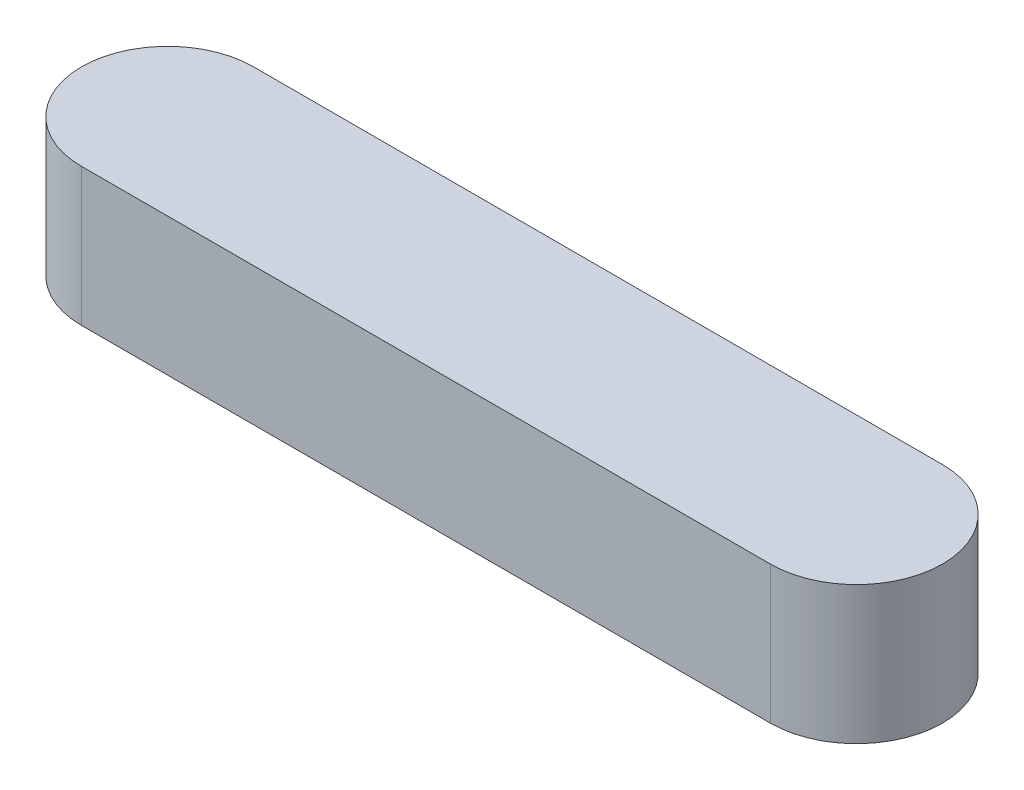
ISO-10303-21;
HEADER;
FILE_DESCRIPTION(('STEP AP214'),'2;1');
FILE_NAME('part.step','',(''),(''),'','','');
FILE_SCHEMA(('AUTOMOTIVE_DESIGN { 1 0 10303 214 1 1 1 1 }'));
ENDSEC;
DATA;
#1=APPLICATION_CONTEXT('core data for automotive mechanical design processes');
#2=APPLICATION_PROTOCOL_DEFINITION('international standard','automotive_design',2000,#1);
#3=PRODUCT_CONTEXT('',#1,'mechanical');
#4=PRODUCT('Part','Part','',(#3));
#5=PRODUCT_RELATED_PRODUCT_CATEGORY('part','',(#4));
#6=PRODUCT_DEFINITION_FORMATION('','',#4);
#7=PRODUCT_DEFINITION_CONTEXT('part definition',#1,'design');
#8=PRODUCT_DEFINITION('design','',#6,#7);
#9=PRODUCT_DEFINITION_SHAPE('','',#8);
#10=(LENGTH_UNIT() NAMED_UNIT(*) SI_UNIT(.MILLI.,.METRE.));
#11=(NAMED_UNIT(*) PLANE_ANGLE_UNIT() SI_UNIT($,.RADIAN.));
#12=(NAMED_UNIT(*) SI_UNIT($,.STERADIAN.) SOLID_ANGLE_UNIT());
#13=UNCERTAINTY_MEASURE_WITH_UNIT(LENGTH_MEASURE(1.E-05),#10,'distance_accuracy_value','');
#14=(GEOMETRIC_REPRESENTATION_CONTEXT(3) GLOBAL_UNCERTAINTY_ASSIGNED_CONTEXT((#13)) GLOBAL_UNIT_ASSIGNED_CONTEXT((#10,
#11,#12)) REPRESENTATION_CONTEXT('',''));
#15=CARTESIAN_POINT('',(0.,0.,0.));
#16=DIRECTION('',(0.,0.,1.));
#17=DIRECTION('',(1.,0.,0.));
#18=AXIS2_PLACEMENT_3D('',#15,#16,#17);
#19=CARTESIAN_POINT('',(-20.0000000000001,58.9901951359278,3.05311331771918E-13));
#20=DIRECTION('',(0.,-1.,0.));
#21=DIRECTION('',(0.,0.,-1.));
#22=AXIS2_PLACEMENT_3D('',#19,#20,#21);
#23=CYLINDRICAL_SURFACE('',#22,5.);
#24=CARTESIAN_POINT('',(-20.0000000000001,8.00000000000001,0.));
#25=DIRECTION('',(0.,1.,0.));
#26=DIRECTION('',(0.,0.,1.));
#27=AXIS2_PLACEMENT_3D('',#24,#25,#26);
#28=CIRCLE('',#27,5.);
#29=CARTESIAN_POINT('',(-20.0000000000001,8.00000000000001,-5.));
#30=VERTEX_POINT('',#29);
#31=CARTESIAN_POINT('',(-20.0000000000001,8.00000000000001,5.));
#32=VERTEX_POINT('',#31);
#33=EDGE_CURVE('E92',#30,#32,#28,.T.);
#34=ORIENTED_EDGE('',*,*,#33,.F.);
#35=DIRECTION('',(0.,-1.,0.));
#36=VECTOR('',#35,1.);
#37=CARTESIAN_POINT('',(-20.0000000000001,58.9901951359278,-4.9999999999997));
#38=LINE('',#37,#36);
#39=CARTESIAN_POINT('',(-20.0000000000001,0.,-5.));
#40=VERTEX_POINT('',#39);
#41=EDGE_CURVE('E46',#30,#40,#38,.T.);
#42=ORIENTED_EDGE('',*,*,#41,.T.);
#43=CARTESIAN_POINT('',(-20.0000000000001,0.,0.));
#44=DIRECTION('',(0.,1.,0.));
#45=DIRECTION('',(0.,0.,1.));
#46=AXIS2_PLACEMENT_3D('',#43,#44,#45);
#47=CIRCLE('',#46,5.);
#48=CARTESIAN_POINT('',(-20.0000000000001,0.,5.));
#49=VERTEX_POINT('',#48);
#50=EDGE_CURVE('E90',#40,#49,#47,.T.);
#51=ORIENTED_EDGE('',*,*,#50,.T.);
#52=DIRECTION('',(0.,-1.,0.));
#53=VECTOR('',#52,1.);
#54=CARTESIAN_POINT('',(-20.0000000000001,58.9901951359278,5.));
#55=LINE('',#54,#53);
#56=EDGE_CURVE('E81',#32,#49,#55,.T.);
#57=ORIENTED_EDGE('',*,*,#56,.F.);
#58=EDGE_LOOP('',(#34,#42,#51,#57));
#59=FACE_BOUND('',#58,.T.);
#60=ADVANCED_FACE('F42',(#59),#23,.T.);
#61=CARTESIAN_POINT('',(-20.0000000000001,58.9901951359278,5.));
#62=DIRECTION('',(0.,0.,-1.));
#63=DIRECTION('',(-1.,0.,0.));
#64=AXIS2_PLACEMENT_3D('',#61,#62,#63);
#65=PLANE('',#64);
#66=DIRECTION('',(1.,0.,0.));
#67=VECTOR('',#66,1.);
#68=CARTESIAN_POINT('',(-20.0000000000001,8.00000000000001,5.));
#69=LINE('',#68,#67);
#70=CARTESIAN_POINT('',(20.0000000000001,7.99999999999999,5.));
#71=VERTEX_POINT('',#70);
#72=EDGE_CURVE('E51',#32,#71,#69,.T.);
#73=ORIENTED_EDGE('',*,*,#72,.F.);
#74=ORIENTED_EDGE('',*,*,#56,.T.);
#75=DIRECTION('',(1.,0.,0.));
#76=VECTOR('',#75,1.);
#77=CARTESIAN_POINT('',(-20.0000000000001,0.,5.));
#78=LINE('',#77,#76);
#79=CARTESIAN_POINT('',(20.0000000000001,0.,5.));
#80=VERTEX_POINT('',#79);
#81=EDGE_CURVE('E102',#49,#80,#78,.T.);
#82=ORIENTED_EDGE('',*,*,#81,.T.);
#83=DIRECTION('',(0.,-1.,0.));
#84=VECTOR('',#83,1.);
#85=CARTESIAN_POINT('',(20.,58.9901951359279,5.));
#86=LINE('',#85,#84);
#87=EDGE_CURVE('E111',#71,#80,#86,.T.);
#88=ORIENTED_EDGE('',*,*,#87,.F.);
#89=EDGE_LOOP('',(#73,#74,#82,#88));
#90=FACE_BOUND('',#89,.T.);
#91=ADVANCED_FACE('F115',(#90),#65,.F.);
#92=CARTESIAN_POINT('',(20.,58.9901951359279,0.));
#93=DIRECTION('',(0.,-1.,0.));
#94=DIRECTION('',(0.,0.,-1.));
#95=AXIS2_PLACEMENT_3D('',#92,#93,#94);
#96=CYLINDRICAL_SURFACE('',#95,5.);
#97=CARTESIAN_POINT('',(20.,7.99999999999999,-3.05311331771918E-13));
#98=DIRECTION('',(0.,1.,0.));
#99=DIRECTION('',(0.,0.,1.));
#100=AXIS2_PLACEMENT_3D('',#97,#98,#99);
#101=CIRCLE('',#100,5.);
#102=CARTESIAN_POINT('',(20.,7.99999999999999,-5.00000000000031));
#103=VERTEX_POINT('',#102);
#104=EDGE_CURVE('E13',#71,#103,#101,.T.);
#105=ORIENTED_EDGE('',*,*,#104,.F.);
#106=ORIENTED_EDGE('',*,*,#87,.T.);
#107=CARTESIAN_POINT('',(20.0000000000001,0.,-3.05311331771918E-13));
#108=DIRECTION('',(0.,1.,0.));
#109=DIRECTION('',(0.,0.,1.));
#110=AXIS2_PLACEMENT_3D('',#107,#108,#109);
#111=CIRCLE('',#110,5.);
#112=CARTESIAN_POINT('',(20.,0.,-5.00000000000031));
#113=VERTEX_POINT('',#112);
#114=EDGE_CURVE('E112',#80,#113,#111,.T.);
#115=ORIENTED_EDGE('',*,*,#114,.T.);
#116=DIRECTION('',(0.,-1.,0.));
#117=VECTOR('',#116,1.);
#118=CARTESIAN_POINT('',(20.,58.9901951359279,-5.));
#119=LINE('',#118,#117);
#120=EDGE_CURVE('E64',#103,#113,#119,.T.);
#121=ORIENTED_EDGE('',*,*,#120,.F.);
#122=EDGE_LOOP('',(#105,#106,#115,#121));
#123=FACE_BOUND('',#122,.T.);
#124=ADVANCED_FACE('F114',(#123),#96,.T.);
#125=CARTESIAN_POINT('',(20.,58.9901951359279,-5.));
#126=DIRECTION('',(0.,0.,1.));
#127=DIRECTION('',(1.,0.,0.));
#128=AXIS2_PLACEMENT_3D('',#125,#126,#127);
#129=PLANE('',#128);
#130=DIRECTION('',(-1.,0.,0.));
#131=VECTOR('',#130,1.);
#132=CARTESIAN_POINT('',(20.,7.99999999999999,-5.00000000000031));
#133=LINE('',#132,#131);
#134=EDGE_CURVE('E99',#103,#30,#133,.T.);
#135=ORIENTED_EDGE('',*,*,#134,.F.);
#136=ORIENTED_EDGE('',*,*,#120,.T.);
#137=DIRECTION('',(-1.,0.,0.));
#138=VECTOR('',#137,1.);
#139=CARTESIAN_POINT('',(20.,0.,-5.00000000000031));
#140=LINE('',#139,#138);
#141=EDGE_CURVE('E95',#113,#40,#140,.T.);
#142=ORIENTED_EDGE('',*,*,#141,.T.);
#143=ORIENTED_EDGE('',*,*,#41,.F.);
#144=EDGE_LOOP('',(#135,#136,#142,#143));
#145=FACE_BOUND('',#144,.T.);
#146=ADVANCED_FACE('F96',(#145),#129,.F.);
#147=CARTESIAN_POINT('',(-20.0000000000001,0.,0.));
#148=DIRECTION('',(0.,1.,0.));
#149=DIRECTION('',(0.,0.,1.));
#150=AXIS2_PLACEMENT_3D('',#147,#148,#149);
#151=PLANE('',#150);
#152=ORIENTED_EDGE('',*,*,#50,.F.);
#153=ORIENTED_EDGE('',*,*,#141,.F.);
#154=ORIENTED_EDGE('',*,*,#114,.F.);
#155=ORIENTED_EDGE('',*,*,#81,.F.);
#156=EDGE_LOOP('',(#152,#153,#154,#155));
#157=FACE_BOUND('',#156,.T.);
#158=ADVANCED_FACE('F101',(#157),#151,.F.);
#159=CARTESIAN_POINT('',(0.,7.99999999999999,0.));
#160=DIRECTION('',(0.,1.,0.));
#161=DIRECTION('',(0.,0.,1.));
#162=AXIS2_PLACEMENT_3D('',#159,#160,#161);
#163=PLANE('',#162);
#164=ORIENTED_EDGE('',*,*,#134,.T.);
#165=ORIENTED_EDGE('',*,*,#33,.T.);
#166=ORIENTED_EDGE('',*,*,#72,.T.);
#167=ORIENTED_EDGE('',*,*,#104,.T.);
#168=EDGE_LOOP('',(#164,#165,#166,#167));
#169=FACE_BOUND('',#168,.T.);
#170=ADVANCED_FACE('F44',(#169),#163,.T.);
#171=CLOSED_SHELL('',(#60,#91,#124,#146,#158,#170));
#172=MANIFOLD_SOLID_BREP('B2',#171);
#173=ADVANCED_BREP_SHAPE_REPRESENTATION('',(#18,#172),#14);
#174=SHAPE_DEFINITION_REPRESENTATION(#9,#173);
ENDSEC;
END-ISO-10303-21;
